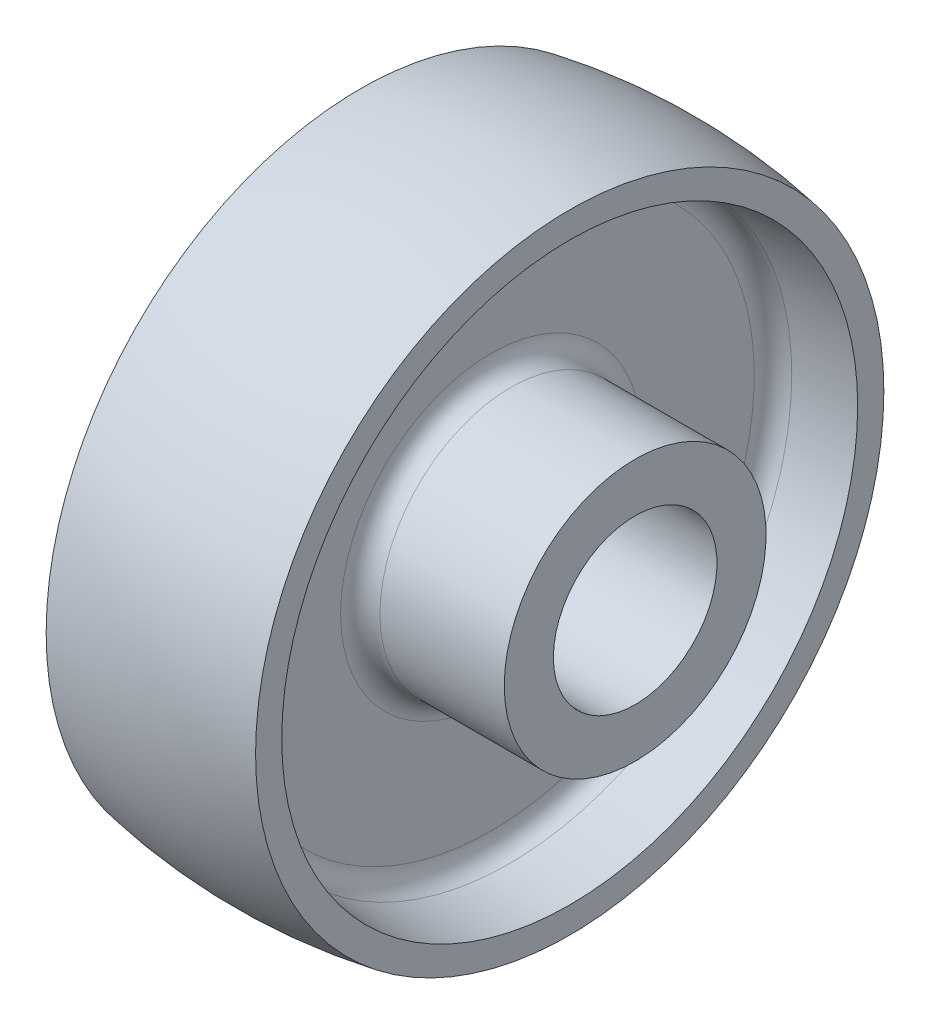
ISO-10303-21;
HEADER;
FILE_DESCRIPTION(('STEP AP214'),'2;1');
FILE_NAME('part.step','',(''),(''),'','','');
FILE_SCHEMA(('AUTOMOTIVE_DESIGN { 1 0 10303 214 1 1 1 1 }'));
ENDSEC;
DATA;
#1=APPLICATION_CONTEXT('core data for automotive mechanical design processes');
#2=APPLICATION_PROTOCOL_DEFINITION('international standard','automotive_design',2000,#1);
#3=PRODUCT_CONTEXT('',#1,'mechanical');
#4=PRODUCT('Part','Part','',(#3));
#5=PRODUCT_RELATED_PRODUCT_CATEGORY('part','',(#4));
#6=PRODUCT_DEFINITION_FORMATION('','',#4);
#7=PRODUCT_DEFINITION_CONTEXT('part definition',#1,'design');
#8=PRODUCT_DEFINITION('design','',#6,#7);
#9=PRODUCT_DEFINITION_SHAPE('','',#8);
#10=(LENGTH_UNIT() NAMED_UNIT(*) SI_UNIT(.MILLI.,.METRE.));
#11=(NAMED_UNIT(*) PLANE_ANGLE_UNIT() SI_UNIT($,.RADIAN.));
#12=(NAMED_UNIT(*) SI_UNIT($,.STERADIAN.) SOLID_ANGLE_UNIT());
#13=UNCERTAINTY_MEASURE_WITH_UNIT(LENGTH_MEASURE(1.E-05),#10,'distance_accuracy_value','');
#14=(GEOMETRIC_REPRESENTATION_CONTEXT(3) GLOBAL_UNCERTAINTY_ASSIGNED_CONTEXT((#13)) GLOBAL_UNIT_ASSIGNED_CONTEXT((#10,
#11,#12)) REPRESENTATION_CONTEXT('',''));
#15=CARTESIAN_POINT('',(0.,0.,0.));
#16=DIRECTION('',(0.,0.,1.));
#17=DIRECTION('',(1.,0.,0.));
#18=AXIS2_PLACEMENT_3D('',#15,#16,#17);
#19=CARTESIAN_POINT('',(26.,20.,0.));
#20=DIRECTION('',(-1.,0.,0.));
#21=DIRECTION('',(0.,0.,1.));
#22=AXIS2_PLACEMENT_3D('',#19,#20,#21);
#23=PLANE('',#22);
#24=CARTESIAN_POINT('',(26.,0.,0.));
#25=DIRECTION('',(-1.,0.,0.));
#26=DIRECTION('',(0.,0.,1.));
#27=AXIS2_PLACEMENT_3D('',#24,#25,#26);
#28=CIRCLE('',#27,20.);
#29=CARTESIAN_POINT('',(26.,0.,20.));
#30=VERTEX_POINT('',#29);
#31=EDGE_CURVE('E88',#30,#30,#28,.T.);
#32=ORIENTED_EDGE('',*,*,#31,.F.);
#33=EDGE_LOOP('',(#32));
#34=FACE_BOUND('',#33,.T.);
#35=CARTESIAN_POINT('',(26.,0.,0.));
#36=DIRECTION('',(-1.,0.,0.));
#37=DIRECTION('',(0.,0.,1.));
#38=AXIS2_PLACEMENT_3D('',#35,#36,#37);
#39=CIRCLE('',#38,12.5);
#40=CARTESIAN_POINT('',(26.,0.,12.5));
#41=VERTEX_POINT('',#40);
#42=EDGE_CURVE('E67',#41,#41,#39,.T.);
#43=ORIENTED_EDGE('',*,*,#42,.T.);
#44=EDGE_LOOP('',(#43));
#45=FACE_BOUND('',#44,.T.);
#46=ADVANCED_FACE('F35',(#34,#45),#23,.F.);
#47=CARTESIAN_POINT('',(0.,0.,0.));
#48=DIRECTION('',(-1.,0.,0.));
#49=DIRECTION('',(0.,0.,1.));
#50=AXIS2_PLACEMENT_3D('',#47,#48,#49);
#51=CYLINDRICAL_SURFACE('',#50,12.5);
#52=ORIENTED_EDGE('',*,*,#42,.F.);
#53=EDGE_LOOP('',(#52));
#54=FACE_BOUND('',#53,.T.);
#55=CARTESIAN_POINT('',(-26.,0.,0.));
#56=DIRECTION('',(-1.,0.,0.));
#57=DIRECTION('',(0.,0.,1.));
#58=AXIS2_PLACEMENT_3D('',#55,#56,#57);
#59=CIRCLE('',#58,12.5);
#60=CARTESIAN_POINT('',(-26.,0.,12.5));
#61=VERTEX_POINT('',#60);
#62=EDGE_CURVE('E70',#61,#61,#59,.T.);
#63=ORIENTED_EDGE('',*,*,#62,.T.);
#64=EDGE_LOOP('',(#63));
#65=FACE_BOUND('',#64,.T.);
#66=ADVANCED_FACE('F96',(#54,#65),#51,.F.);
#67=CARTESIAN_POINT('',(-26.,12.5,0.));
#68=DIRECTION('',(1.,0.,0.));
#69=DIRECTION('',(0.,0.,-1.));
#70=AXIS2_PLACEMENT_3D('',#67,#68,#69);
#71=PLANE('',#70);
#72=ORIENTED_EDGE('',*,*,#62,.F.);
#73=EDGE_LOOP('',(#72));
#74=FACE_BOUND('',#73,.T.);
#75=CARTESIAN_POINT('',(-26.,0.,0.));
#76=DIRECTION('',(-1.,0.,0.));
#77=DIRECTION('',(0.,0.,1.));
#78=AXIS2_PLACEMENT_3D('',#75,#76,#77);
#79=CIRCLE('',#78,20.);
#80=CARTESIAN_POINT('',(-26.,0.,20.));
#81=VERTEX_POINT('',#80);
#82=EDGE_CURVE('E73',#81,#81,#79,.T.);
#83=ORIENTED_EDGE('',*,*,#82,.T.);
#84=EDGE_LOOP('',(#83));
#85=FACE_BOUND('',#84,.T.);
#86=ADVANCED_FACE('F102',(#74,#85),#71,.F.);
#87=CARTESIAN_POINT('',(0.,0.,0.));
#88=DIRECTION('',(-1.,0.,0.));
#89=DIRECTION('',(0.,0.,1.));
#90=AXIS2_PLACEMENT_3D('',#87,#88,#89);
#91=CYLINDRICAL_SURFACE('',#90,20.);
#92=CARTESIAN_POINT('',(-7.,0.,0.));
#93=DIRECTION('',(1.,0.,0.));
#94=DIRECTION('',(0.,0.,-1.));
#95=AXIS2_PLACEMENT_3D('',#92,#93,#94);
#96=CIRCLE('',#95,20.);
#97=CARTESIAN_POINT('',(-7.,0.,-20.));
#98=VERTEX_POINT('',#97);
#99=EDGE_CURVE('E10',#98,#98,#96,.F.);
#100=ORIENTED_EDGE('',*,*,#99,.T.);
#101=EDGE_LOOP('',(#100));
#102=FACE_BOUND('',#101,.T.);
#103=ORIENTED_EDGE('',*,*,#82,.F.);
#104=EDGE_LOOP('',(#103));
#105=FACE_BOUND('',#104,.T.);
#106=ADVANCED_FACE('F108',(#102,#105),#91,.T.);
#107=CARTESIAN_POINT('',(-4.,20.,0.));
#108=DIRECTION('',(1.,0.,0.));
#109=DIRECTION('',(0.,0.,-1.));
#110=AXIS2_PLACEMENT_3D('',#107,#108,#109);
#111=PLANE('',#110);
#112=CARTESIAN_POINT('',(-4.,0.,0.));
#113=DIRECTION('',(1.,0.,0.));
#114=DIRECTION('',(0.,0.,-1.));
#115=AXIS2_PLACEMENT_3D('',#112,#113,#114);
#116=CIRCLE('',#115,40.2011425156367);
#117=CARTESIAN_POINT('',(-4.,0.,-40.2011425156367));
#118=VERTEX_POINT('',#117);
#119=EDGE_CURVE('E46',#118,#118,#116,.F.);
#120=ORIENTED_EDGE('',*,*,#119,.T.);
#121=EDGE_LOOP('',(#120));
#122=FACE_BOUND('',#121,.T.);
#123=CARTESIAN_POINT('',(-4.,0.,0.));
#124=DIRECTION('',(1.,0.,0.));
#125=DIRECTION('',(0.,0.,-1.));
#126=AXIS2_PLACEMENT_3D('',#123,#124,#125);
#127=CIRCLE('',#126,23.);
#128=CARTESIAN_POINT('',(-4.,0.,-23.));
#129=VERTEX_POINT('',#128);
#130=EDGE_CURVE('E50',#129,#129,#127,.T.);
#131=ORIENTED_EDGE('',*,*,#130,.T.);
#132=EDGE_LOOP('',(#131));
#133=FACE_BOUND('',#132,.T.);
#134=ADVANCED_FACE('F113',(#122,#133),#111,.F.);
#135=CARTESIAN_POINT('',(-16.,0.,0.));
#136=DIRECTION('',(-1.,0.,0.));
#137=DIRECTION('',(0.,0.,1.));
#138=AXIS2_PLACEMENT_3D('',#135,#136,#137);
#139=CONICAL_SURFACE('',#138,44.,0.0872664625997103);
#140=CARTESIAN_POINT('',(-6.73853277175704,0.,0.));
#141=DIRECTION('',(-1.,0.,0.));
#142=DIRECTION('',(0.,0.,1.));
#143=AXIS2_PLACEMENT_3D('',#140,#141,#142);
#144=CIRCLE('',#143,43.1897266099119);
#145=CARTESIAN_POINT('',(-6.73853277175704,0.,43.1897266099119));
#146=VERTEX_POINT('',#145);
#147=EDGE_CURVE('E42',#146,#146,#144,.F.);
#148=ORIENTED_EDGE('',*,*,#147,.T.);
#149=EDGE_LOOP('',(#148));
#150=FACE_BOUND('',#149,.T.);
#151=CARTESIAN_POINT('',(-16.,0.,0.));
#152=DIRECTION('',(-1.,0.,0.));
#153=DIRECTION('',(0.,0.,1.));
#154=AXIS2_PLACEMENT_3D('',#151,#152,#153);
#155=CIRCLE('',#154,44.);
#156=CARTESIAN_POINT('',(-16.,0.,44.));
#157=VERTEX_POINT('',#156);
#158=EDGE_CURVE('E76',#157,#157,#155,.T.);
#159=ORIENTED_EDGE('',*,*,#158,.T.);
#160=EDGE_LOOP('',(#159));
#161=FACE_BOUND('',#160,.T.);
#162=ADVANCED_FACE('F118',(#150,#161),#139,.F.);
#163=CARTESIAN_POINT('',(-16.,44.,0.));
#164=DIRECTION('',(1.,0.,0.));
#165=DIRECTION('',(0.,0.,-1.));
#166=AXIS2_PLACEMENT_3D('',#163,#164,#165);
#167=PLANE('',#166);
#168=ORIENTED_EDGE('',*,*,#158,.F.);
#169=EDGE_LOOP('',(#168));
#170=FACE_BOUND('',#169,.T.);
#171=CARTESIAN_POINT('',(-16.,0.,0.));
#172=DIRECTION('',(-1.,0.,0.));
#173=DIRECTION('',(0.,0.,1.));
#174=AXIS2_PLACEMENT_3D('',#171,#172,#173);
#175=CIRCLE('',#174,48.);
#176=CARTESIAN_POINT('',(-16.,0.,48.));
#177=VERTEX_POINT('',#176);
#178=EDGE_CURVE('E79',#177,#177,#175,.T.);
#179=ORIENTED_EDGE('',*,*,#178,.T.);
#180=EDGE_LOOP('',(#179));
#181=FACE_BOUND('',#180,.T.);
#182=ADVANCED_FACE('F201',(#170,#181),#167,.F.);
#183=CARTESIAN_POINT('',(0.,0.,0.));
#184=DIRECTION('',(-1.,0.,0.));
#185=DIRECTION('',(0.,0.,1.));
#186=AXIS2_PLACEMENT_3D('',#183,#184,#185);
#187=DEGENERATE_TOROIDAL_SURFACE('',#186,40.5663593019381,90.,.F.);
#188=ORIENTED_EDGE('',*,*,#178,.F.);
#189=EDGE_LOOP('',(#188));
#190=FACE_BOUND('',#189,.T.);
#191=CARTESIAN_POINT('',(16.,0.,0.));
#192=DIRECTION('',(-1.,0.,0.));
#193=DIRECTION('',(0.,0.,1.));
#194=AXIS2_PLACEMENT_3D('',#191,#192,#193);
#195=CIRCLE('',#194,48.);
#196=CARTESIAN_POINT('',(16.,0.,48.));
#197=VERTEX_POINT('',#196);
#198=EDGE_CURVE('E82',#197,#197,#195,.T.);
#199=ORIENTED_EDGE('',*,*,#198,.T.);
#200=EDGE_LOOP('',(#199));
#201=FACE_BOUND('',#200,.T.);
#202=ADVANCED_FACE('F220',(#190,#201),#187,.F.);
#203=CARTESIAN_POINT('',(16.,48.,0.));
#204=DIRECTION('',(-1.,0.,0.));
#205=DIRECTION('',(0.,0.,1.));
#206=AXIS2_PLACEMENT_3D('',#203,#204,#205);
#207=PLANE('',#206);
#208=ORIENTED_EDGE('',*,*,#198,.F.);
#209=EDGE_LOOP('',(#208));
#210=FACE_BOUND('',#209,.T.);
#211=CARTESIAN_POINT('',(16.,0.,0.));
#212=DIRECTION('',(-1.,0.,0.));
#213=DIRECTION('',(0.,0.,1.));
#214=AXIS2_PLACEMENT_3D('',#211,#212,#213);
#215=CIRCLE('',#214,44.);
#216=CARTESIAN_POINT('',(16.,0.,44.));
#217=VERTEX_POINT('',#216);
#218=EDGE_CURVE('E85',#217,#217,#215,.T.);
#219=ORIENTED_EDGE('',*,*,#218,.T.);
#220=EDGE_LOOP('',(#219));
#221=FACE_BOUND('',#220,.T.);
#222=ADVANCED_FACE('F189',(#210,#221),#207,.F.);
#223=CARTESIAN_POINT('',(4.00000000000001,0.,0.));
#224=DIRECTION('',(1.,0.,0.));
#225=DIRECTION('',(0.,0.,-1.));
#226=AXIS2_PLACEMENT_3D('',#223,#224,#225);
#227=CONICAL_SURFACE('',#226,42.950136037689,0.0872664625997097);
#228=CARTESIAN_POINT('',(6.73853277175705,0.,0.));
#229=DIRECTION('',(1.,0.,0.));
#230=DIRECTION('',(0.,0.,-1.));
#231=AXIS2_PLACEMENT_3D('',#228,#229,#230);
#232=CIRCLE('',#231,43.1897266099119);
#233=CARTESIAN_POINT('',(6.73853277175705,0.,-43.1897266099119));
#234=VERTEX_POINT('',#233);
#235=EDGE_CURVE('E55',#234,#234,#232,.F.);
#236=ORIENTED_EDGE('',*,*,#235,.T.);
#237=EDGE_LOOP('',(#236));
#238=FACE_BOUND('',#237,.T.);
#239=ORIENTED_EDGE('',*,*,#218,.F.);
#240=EDGE_LOOP('',(#239));
#241=FACE_BOUND('',#240,.T.);
#242=ADVANCED_FACE('F179',(#238,#241),#227,.F.);
#243=CARTESIAN_POINT('',(4.00000000000001,42.950136037689,0.));
#244=DIRECTION('',(-1.,0.,0.));
#245=DIRECTION('',(0.,0.,1.));
#246=AXIS2_PLACEMENT_3D('',#243,#244,#245);
#247=PLANE('',#246);
#248=CARTESIAN_POINT('',(4.00000000000001,0.,0.));
#249=DIRECTION('',(-1.,0.,0.));
#250=DIRECTION('',(0.,0.,1.));
#251=AXIS2_PLACEMENT_3D('',#248,#249,#250);
#252=CIRCLE('',#251,23.);
#253=CARTESIAN_POINT('',(4.00000000000001,0.,23.));
#254=VERTEX_POINT('',#253);
#255=EDGE_CURVE('E61',#254,#254,#252,.T.);
#256=ORIENTED_EDGE('',*,*,#255,.T.);
#257=EDGE_LOOP('',(#256));
#258=FACE_BOUND('',#257,.T.);
#259=CARTESIAN_POINT('',(4.00000000000001,0.,0.));
#260=DIRECTION('',(-1.,0.,0.));
#261=DIRECTION('',(0.,0.,1.));
#262=AXIS2_PLACEMENT_3D('',#259,#260,#261);
#263=CIRCLE('',#262,40.2011425156367);
#264=CARTESIAN_POINT('',(4.00000000000001,0.,40.2011425156367));
#265=VERTEX_POINT('',#264);
#266=EDGE_CURVE('E64',#265,#265,#263,.F.);
#267=ORIENTED_EDGE('',*,*,#266,.T.);
#268=EDGE_LOOP('',(#267));
#269=FACE_BOUND('',#268,.T.);
#270=ADVANCED_FACE('F169',(#258,#269),#247,.F.);
#271=CARTESIAN_POINT('',(0.,0.,0.));
#272=DIRECTION('',(-1.,0.,0.));
#273=DIRECTION('',(0.,0.,1.));
#274=AXIS2_PLACEMENT_3D('',#271,#272,#273);
#275=CYLINDRICAL_SURFACE('',#274,20.);
#276=CARTESIAN_POINT('',(7.00000000000001,0.,0.));
#277=DIRECTION('',(-1.,0.,0.));
#278=DIRECTION('',(0.,0.,1.));
#279=AXIS2_PLACEMENT_3D('',#276,#277,#278);
#280=CIRCLE('',#279,20.);
#281=CARTESIAN_POINT('',(7.00000000000001,0.,20.));
#282=VERTEX_POINT('',#281);
#283=EDGE_CURVE('E58',#282,#282,#280,.F.);
#284=ORIENTED_EDGE('',*,*,#283,.T.);
#285=EDGE_LOOP('',(#284));
#286=FACE_BOUND('',#285,.T.);
#287=ORIENTED_EDGE('',*,*,#31,.T.);
#288=EDGE_LOOP('',(#287));
#289=FACE_BOUND('',#288,.T.);
#290=ADVANCED_FACE('F92',(#286,#289),#275,.T.);
#291=CARTESIAN_POINT('',(7.00000000000001,0.,0.));
#292=DIRECTION('',(-1.,0.,0.));
#293=DIRECTION('',(0.,0.,1.));
#294=AXIS2_PLACEMENT_3D('',#291,#292,#293);
#295=TOROIDAL_SURFACE('',#294,23.,3.);
#296=ORIENTED_EDGE('',*,*,#283,.F.);
#297=EDGE_LOOP('',(#296));
#298=FACE_BOUND('',#297,.T.);
#299=ORIENTED_EDGE('',*,*,#255,.F.);
#300=EDGE_LOOP('',(#299));
#301=FACE_BOUND('',#300,.T.);
#302=ADVANCED_FACE('F123',(#298,#301),#295,.F.);
#303=CARTESIAN_POINT('',(7.00000000000001,0.,0.));
#304=DIRECTION('',(-1.,0.,0.));
#305=DIRECTION('',(0.,0.,1.));
#306=AXIS2_PLACEMENT_3D('',#303,#304,#305);
#307=TOROIDAL_SURFACE('',#306,40.2011425156367,3.);
#308=ORIENTED_EDGE('',*,*,#266,.F.);
#309=EDGE_LOOP('',(#308));
#310=FACE_BOUND('',#309,.T.);
#311=ORIENTED_EDGE('',*,*,#235,.F.);
#312=EDGE_LOOP('',(#311));
#313=FACE_BOUND('',#312,.T.);
#314=ADVANCED_FACE('F126',(#310,#313),#307,.F.);
#315=CARTESIAN_POINT('',(-7.,0.,0.));
#316=DIRECTION('',(1.,0.,0.));
#317=DIRECTION('',(0.,0.,-1.));
#318=AXIS2_PLACEMENT_3D('',#315,#316,#317);
#319=TOROIDAL_SURFACE('',#318,40.2011425156367,3.);
#320=ORIENTED_EDGE('',*,*,#147,.F.);
#321=EDGE_LOOP('',(#320));
#322=FACE_BOUND('',#321,.T.);
#323=ORIENTED_EDGE('',*,*,#119,.F.);
#324=EDGE_LOOP('',(#323));
#325=FACE_BOUND('',#324,.T.);
#326=ADVANCED_FACE('F129',(#322,#325),#319,.F.);
#327=CARTESIAN_POINT('',(-7.,0.,0.));
#328=DIRECTION('',(1.,0.,0.));
#329=DIRECTION('',(0.,0.,-1.));
#330=AXIS2_PLACEMENT_3D('',#327,#328,#329);
#331=TOROIDAL_SURFACE('',#330,23.,3.);
#332=ORIENTED_EDGE('',*,*,#130,.F.);
#333=EDGE_LOOP('',(#332));
#334=FACE_BOUND('',#333,.T.);
#335=ORIENTED_EDGE('',*,*,#99,.F.);
#336=EDGE_LOOP('',(#335));
#337=FACE_BOUND('',#336,.T.);
#338=ADVANCED_FACE('F37',(#334,#337),#331,.F.);
#339=CLOSED_SHELL('',(#46,#66,#86,#106,#134,#162,#182,#202,#222,#242,#270,#290,#302,#314,#326,#338));
#340=MANIFOLD_SOLID_BREP('B2',#339);
#341=ADVANCED_BREP_SHAPE_REPRESENTATION('',(#18,#340),#14);
#342=SHAPE_DEFINITION_REPRESENTATION(#9,#341);
ENDSEC;
END-ISO-10303-21;
